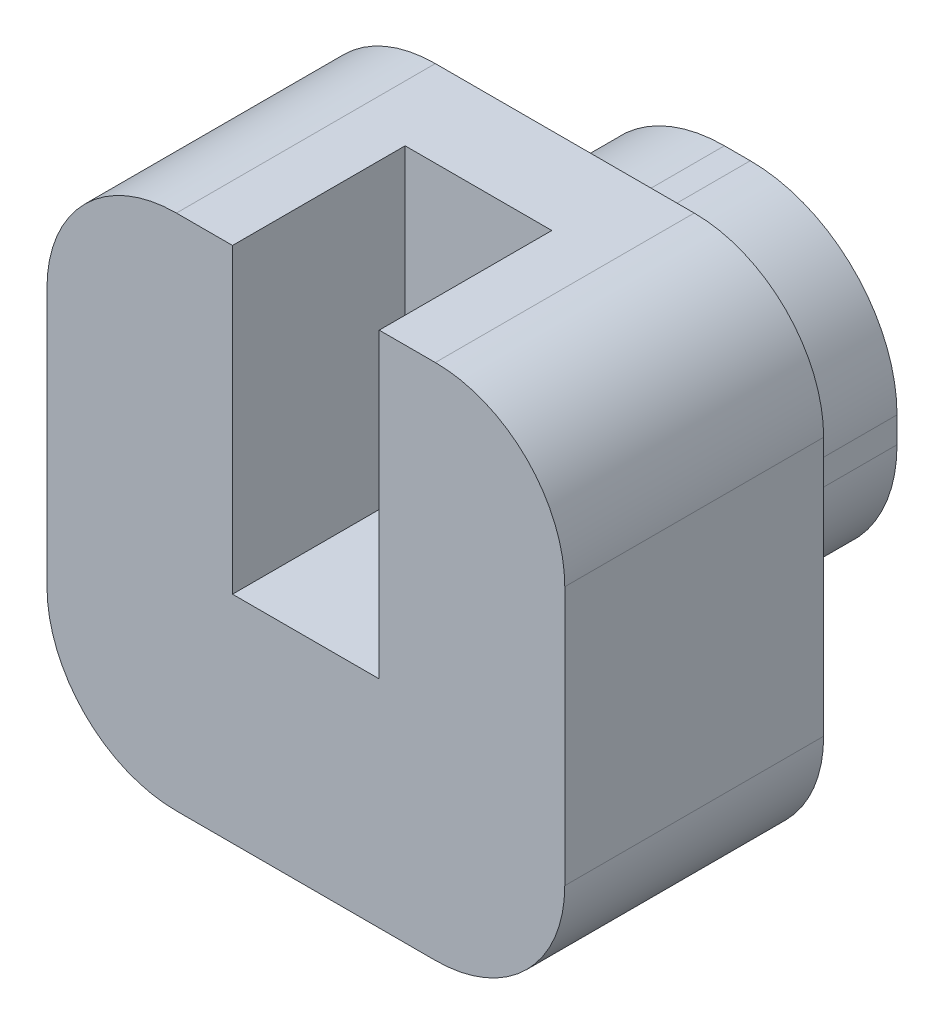
ISO-10303-21;
HEADER;
FILE_DESCRIPTION(('STEP AP214'),'2;1');
FILE_NAME('part.step','',(''),(''),'','','');
FILE_SCHEMA(('AUTOMOTIVE_DESIGN { 1 0 10303 214 1 1 1 1 }'));
ENDSEC;
DATA;
#1=APPLICATION_CONTEXT('core data for automotive mechanical design processes');
#2=APPLICATION_PROTOCOL_DEFINITION('international standard','automotive_design',2000,#1);
#3=PRODUCT_CONTEXT('',#1,'mechanical');
#4=PRODUCT('Part','Part','',(#3));
#5=PRODUCT_RELATED_PRODUCT_CATEGORY('part','',(#4));
#6=PRODUCT_DEFINITION_FORMATION('','',#4);
#7=PRODUCT_DEFINITION_CONTEXT('part definition',#1,'design');
#8=PRODUCT_DEFINITION('design','',#6,#7);
#9=PRODUCT_DEFINITION_SHAPE('','',#8);
#10=(LENGTH_UNIT() NAMED_UNIT(*) SI_UNIT(.MILLI.,.METRE.));
#11=(NAMED_UNIT(*) PLANE_ANGLE_UNIT() SI_UNIT($,.RADIAN.));
#12=(NAMED_UNIT(*) SI_UNIT($,.STERADIAN.) SOLID_ANGLE_UNIT());
#13=UNCERTAINTY_MEASURE_WITH_UNIT(LENGTH_MEASURE(1.E-05),#10,'distance_accuracy_value','');
#14=(GEOMETRIC_REPRESENTATION_CONTEXT(3) GLOBAL_UNCERTAINTY_ASSIGNED_CONTEXT((#13)) GLOBAL_UNIT_ASSIGNED_CONTEXT((#10,
#11,#12)) REPRESENTATION_CONTEXT('',''));
#15=CARTESIAN_POINT('',(0.,0.,0.));
#16=DIRECTION('',(0.,0.,1.));
#17=DIRECTION('',(1.,0.,0.));
#18=AXIS2_PLACEMENT_3D('',#15,#16,#17);
#19=CARTESIAN_POINT('',(-0.15,-0.15,2.));
#20=DIRECTION('',(0.,0.,-1.));
#21=DIRECTION('',(-1.,0.,0.));
#22=AXIS2_PLACEMENT_3D('',#19,#20,#21);
#23=CYLINDRICAL_SURFACE('',#22,1.7);
#24=CARTESIAN_POINT('',(-0.15,-0.15,0.));
#25=DIRECTION('',(0.,0.,1.));
#26=DIRECTION('',(1.,0.,0.));
#27=AXIS2_PLACEMENT_3D('',#24,#25,#26);
#28=CIRCLE('',#27,1.7);
#29=CARTESIAN_POINT('',(-1.85,-0.15,0.));
#30=VERTEX_POINT('',#29);
#31=CARTESIAN_POINT('',(-0.15,-1.85,0.));
#32=VERTEX_POINT('',#31);
#33=EDGE_CURVE('E161',#30,#32,#28,.T.);
#34=ORIENTED_EDGE('',*,*,#33,.T.);
#35=DIRECTION('',(0.,0.,-1.));
#36=VECTOR('',#35,1.);
#37=CARTESIAN_POINT('',(-0.15,-1.85,2.));
#38=LINE('',#37,#36);
#39=CARTESIAN_POINT('',(-0.15,-1.85,2.));
#40=VERTEX_POINT('',#39);
#41=EDGE_CURVE('E11',#40,#32,#38,.T.);
#42=ORIENTED_EDGE('',*,*,#41,.F.);
#43=CARTESIAN_POINT('',(-0.15,-0.15,2.));
#44=DIRECTION('',(0.,0.,1.));
#45=DIRECTION('',(1.,0.,0.));
#46=AXIS2_PLACEMENT_3D('',#43,#44,#45);
#47=CIRCLE('',#46,1.7);
#48=CARTESIAN_POINT('',(-1.85,-0.15,2.));
#49=VERTEX_POINT('',#48);
#50=EDGE_CURVE('E185',#49,#40,#47,.T.);
#51=ORIENTED_EDGE('',*,*,#50,.F.);
#52=DIRECTION('',(0.,0.,-1.));
#53=VECTOR('',#52,1.);
#54=CARTESIAN_POINT('',(-1.85,-0.15,2.));
#55=LINE('',#54,#53);
#56=EDGE_CURVE('E160',#49,#30,#55,.T.);
#57=ORIENTED_EDGE('',*,*,#56,.T.);
#58=EDGE_LOOP('',(#34,#42,#51,#57));
#59=FACE_BOUND('',#58,.T.);
#60=ADVANCED_FACE('F39',(#59),#23,.T.);
#61=CARTESIAN_POINT('',(-0.15,-1.85,2.));
#62=DIRECTION('',(0.,1.,0.));
#63=DIRECTION('',(0.,0.,1.));
#64=AXIS2_PLACEMENT_3D('',#61,#62,#63);
#65=PLANE('',#64);
#66=DIRECTION('',(1.,0.,0.));
#67=VECTOR('',#66,1.);
#68=CARTESIAN_POINT('',(-0.15,-1.85,0.));
#69=LINE('',#68,#67);
#70=CARTESIAN_POINT('',(0.150000000000001,-1.85,0.));
#71=VERTEX_POINT('',#70);
#72=EDGE_CURVE('E165',#32,#71,#69,.T.);
#73=ORIENTED_EDGE('',*,*,#72,.T.);
#74=DIRECTION('',(0.,0.,-1.));
#75=VECTOR('',#74,1.);
#76=CARTESIAN_POINT('',(0.150000000000001,-1.85,2.));
#77=LINE('',#76,#75);
#78=CARTESIAN_POINT('',(0.150000000000001,-1.85,2.));
#79=VERTEX_POINT('',#78);
#80=EDGE_CURVE('E47',#79,#71,#77,.T.);
#81=ORIENTED_EDGE('',*,*,#80,.F.);
#82=DIRECTION('',(1.,0.,0.));
#83=VECTOR('',#82,1.);
#84=CARTESIAN_POINT('',(-0.15,-1.85,2.));
#85=LINE('',#84,#83);
#86=EDGE_CURVE('E104',#40,#79,#85,.T.);
#87=ORIENTED_EDGE('',*,*,#86,.F.);
#88=ORIENTED_EDGE('',*,*,#41,.T.);
#89=EDGE_LOOP('',(#73,#81,#87,#88));
#90=FACE_BOUND('',#89,.T.);
#91=ADVANCED_FACE('F467',(#90),#65,.F.);
#92=CARTESIAN_POINT('',(0.15,-0.15,2.));
#93=DIRECTION('',(0.,0.,-1.));
#94=DIRECTION('',(-1.,0.,0.));
#95=AXIS2_PLACEMENT_3D('',#92,#93,#94);
#96=CYLINDRICAL_SURFACE('',#95,1.7);
#97=CARTESIAN_POINT('',(0.15,-0.15,0.));
#98=DIRECTION('',(0.,0.,1.));
#99=DIRECTION('',(-1.,0.,0.));
#100=AXIS2_PLACEMENT_3D('',#97,#98,#99);
#101=CIRCLE('',#100,1.7);
#102=CARTESIAN_POINT('',(1.85,-0.15,0.));
#103=VERTEX_POINT('',#102);
#104=EDGE_CURVE('E169',#71,#103,#101,.T.);
#105=ORIENTED_EDGE('',*,*,#104,.T.);
#106=DIRECTION('',(0.,0.,-1.));
#107=VECTOR('',#106,1.);
#108=CARTESIAN_POINT('',(1.85,-0.15,2.));
#109=LINE('',#108,#107);
#110=CARTESIAN_POINT('',(1.85,-0.15,2.));
#111=VERTEX_POINT('',#110);
#112=EDGE_CURVE('E194',#111,#103,#109,.T.);
#113=ORIENTED_EDGE('',*,*,#112,.F.);
#114=CARTESIAN_POINT('',(0.15,-0.15,2.));
#115=DIRECTION('',(0.,0.,1.));
#116=DIRECTION('',(-1.,0.,0.));
#117=AXIS2_PLACEMENT_3D('',#114,#115,#116);
#118=CIRCLE('',#117,1.7);
#119=EDGE_CURVE('E151',#79,#111,#118,.T.);
#120=ORIENTED_EDGE('',*,*,#119,.F.);
#121=ORIENTED_EDGE('',*,*,#80,.T.);
#122=EDGE_LOOP('',(#105,#113,#120,#121));
#123=FACE_BOUND('',#122,.T.);
#124=ADVANCED_FACE('F202',(#123),#96,.T.);
#125=CARTESIAN_POINT('',(1.85,-0.15,2.));
#126=DIRECTION('',(-1.,0.,0.));
#127=DIRECTION('',(0.,0.,1.));
#128=AXIS2_PLACEMENT_3D('',#125,#126,#127);
#129=PLANE('',#128);
#130=DIRECTION('',(0.,1.,0.));
#131=VECTOR('',#130,1.);
#132=CARTESIAN_POINT('',(1.85,-0.15,0.));
#133=LINE('',#132,#131);
#134=CARTESIAN_POINT('',(1.85,0.150000000000001,0.));
#135=VERTEX_POINT('',#134);
#136=EDGE_CURVE('E172',#103,#135,#133,.T.);
#137=ORIENTED_EDGE('',*,*,#136,.T.);
#138=DIRECTION('',(0.,0.,-1.));
#139=VECTOR('',#138,1.);
#140=CARTESIAN_POINT('',(1.85,0.150000000000001,2.));
#141=LINE('',#140,#139);
#142=CARTESIAN_POINT('',(1.85,0.150000000000001,2.));
#143=VERTEX_POINT('',#142);
#144=EDGE_CURVE('E131',#143,#135,#141,.T.);
#145=ORIENTED_EDGE('',*,*,#144,.F.);
#146=DIRECTION('',(0.,1.,0.));
#147=VECTOR('',#146,1.);
#148=CARTESIAN_POINT('',(1.85,-0.15,2.));
#149=LINE('',#148,#147);
#150=EDGE_CURVE('E147',#111,#143,#149,.T.);
#151=ORIENTED_EDGE('',*,*,#150,.F.);
#152=ORIENTED_EDGE('',*,*,#112,.T.);
#153=EDGE_LOOP('',(#137,#145,#151,#152));
#154=FACE_BOUND('',#153,.T.);
#155=ADVANCED_FACE('F208',(#154),#129,.F.);
#156=CARTESIAN_POINT('',(0.15,0.150000000000001,2.));
#157=DIRECTION('',(0.,0.,-1.));
#158=DIRECTION('',(-1.,0.,0.));
#159=AXIS2_PLACEMENT_3D('',#156,#157,#158);
#160=CYLINDRICAL_SURFACE('',#159,1.7);
#161=CARTESIAN_POINT('',(0.15,0.150000000000001,0.));
#162=DIRECTION('',(0.,0.,1.));
#163=DIRECTION('',(1.,0.,0.));
#164=AXIS2_PLACEMENT_3D('',#161,#162,#163);
#165=CIRCLE('',#164,1.7);
#166=CARTESIAN_POINT('',(0.15,1.85,0.));
#167=VERTEX_POINT('',#166);
#168=EDGE_CURVE('E127',#135,#167,#165,.T.);
#169=ORIENTED_EDGE('',*,*,#168,.T.);
#170=DIRECTION('',(0.,0.,-1.));
#171=VECTOR('',#170,1.);
#172=CARTESIAN_POINT('',(0.15,1.85,2.));
#173=LINE('',#172,#171);
#174=CARTESIAN_POINT('',(0.15,1.85,2.));
#175=VERTEX_POINT('',#174);
#176=EDGE_CURVE('E119',#175,#167,#173,.T.);
#177=ORIENTED_EDGE('',*,*,#176,.F.);
#178=CARTESIAN_POINT('',(0.15,0.150000000000001,2.));
#179=DIRECTION('',(0.,0.,1.));
#180=DIRECTION('',(1.,0.,0.));
#181=AXIS2_PLACEMENT_3D('',#178,#179,#180);
#182=CIRCLE('',#181,1.7);
#183=EDGE_CURVE('E124',#143,#175,#182,.T.);
#184=ORIENTED_EDGE('',*,*,#183,.F.);
#185=ORIENTED_EDGE('',*,*,#144,.T.);
#186=EDGE_LOOP('',(#169,#177,#184,#185));
#187=FACE_BOUND('',#186,.T.);
#188=ADVANCED_FACE('F121',(#187),#160,.T.);
#189=CARTESIAN_POINT('',(-0.15,1.85,2.));
#190=DIRECTION('',(0.,-1.,0.));
#191=DIRECTION('',(0.,0.,-1.));
#192=AXIS2_PLACEMENT_3D('',#189,#190,#191);
#193=PLANE('',#192);
#194=DIRECTION('',(-1.,0.,0.));
#195=VECTOR('',#194,1.);
#196=CARTESIAN_POINT('',(-0.15,1.85,0.));
#197=LINE('',#196,#195);
#198=CARTESIAN_POINT('',(-0.15,1.85,0.));
#199=VERTEX_POINT('',#198);
#200=EDGE_CURVE('E177',#167,#199,#197,.T.);
#201=ORIENTED_EDGE('',*,*,#200,.T.);
#202=DIRECTION('',(0.,0.,-1.));
#203=VECTOR('',#202,1.);
#204=CARTESIAN_POINT('',(-0.15,1.85,2.));
#205=LINE('',#204,#203);
#206=CARTESIAN_POINT('',(-0.15,1.85,2.));
#207=VERTEX_POINT('',#206);
#208=EDGE_CURVE('E132',#207,#199,#205,.T.);
#209=ORIENTED_EDGE('',*,*,#208,.F.);
#210=DIRECTION('',(-1.,0.,0.));
#211=VECTOR('',#210,1.);
#212=CARTESIAN_POINT('',(-0.15,1.85,2.));
#213=LINE('',#212,#211);
#214=EDGE_CURVE('E135',#175,#207,#213,.T.);
#215=ORIENTED_EDGE('',*,*,#214,.F.);
#216=ORIENTED_EDGE('',*,*,#176,.T.);
#217=EDGE_LOOP('',(#201,#209,#215,#216));
#218=FACE_BOUND('',#217,.T.);
#219=ADVANCED_FACE('F136',(#218),#193,.F.);
#220=CARTESIAN_POINT('',(-0.15,0.150000000000001,2.));
#221=DIRECTION('',(0.,0.,-1.));
#222=DIRECTION('',(-1.,0.,0.));
#223=AXIS2_PLACEMENT_3D('',#220,#221,#222);
#224=CYLINDRICAL_SURFACE('',#223,1.7);
#225=CARTESIAN_POINT('',(-0.15,0.150000000000001,0.));
#226=DIRECTION('',(0.,0.,1.));
#227=DIRECTION('',(1.,0.,0.));
#228=AXIS2_PLACEMENT_3D('',#225,#226,#227);
#229=CIRCLE('',#228,1.7);
#230=CARTESIAN_POINT('',(-1.85,0.150000000000001,0.));
#231=VERTEX_POINT('',#230);
#232=EDGE_CURVE('E180',#199,#231,#229,.T.);
#233=ORIENTED_EDGE('',*,*,#232,.T.);
#234=DIRECTION('',(0.,0.,-1.));
#235=VECTOR('',#234,1.);
#236=CARTESIAN_POINT('',(-1.85,0.150000000000001,2.));
#237=LINE('',#236,#235);
#238=CARTESIAN_POINT('',(-1.85,0.150000000000001,2.));
#239=VERTEX_POINT('',#238);
#240=EDGE_CURVE('E63',#239,#231,#237,.T.);
#241=ORIENTED_EDGE('',*,*,#240,.F.);
#242=CARTESIAN_POINT('',(-0.15,0.150000000000001,2.));
#243=DIRECTION('',(0.,0.,1.));
#244=DIRECTION('',(1.,0.,0.));
#245=AXIS2_PLACEMENT_3D('',#242,#243,#244);
#246=CIRCLE('',#245,1.7);
#247=EDGE_CURVE('E141',#207,#239,#246,.T.);
#248=ORIENTED_EDGE('',*,*,#247,.F.);
#249=ORIENTED_EDGE('',*,*,#208,.T.);
#250=EDGE_LOOP('',(#233,#241,#248,#249));
#251=FACE_BOUND('',#250,.T.);
#252=ADVANCED_FACE('F474',(#251),#224,.T.);
#253=CARTESIAN_POINT('',(-1.85,-0.15,2.));
#254=DIRECTION('',(1.,0.,0.));
#255=DIRECTION('',(0.,0.,-1.));
#256=AXIS2_PLACEMENT_3D('',#253,#254,#255);
#257=PLANE('',#256);
#258=DIRECTION('',(0.,-1.,0.));
#259=VECTOR('',#258,1.);
#260=CARTESIAN_POINT('',(-1.85,-0.15,0.));
#261=LINE('',#260,#259);
#262=EDGE_CURVE('E96',#231,#30,#261,.T.);
#263=ORIENTED_EDGE('',*,*,#262,.T.);
#264=ORIENTED_EDGE('',*,*,#56,.F.);
#265=DIRECTION('',(0.,-1.,0.));
#266=VECTOR('',#265,1.);
#267=CARTESIAN_POINT('',(-1.85,-0.15,2.));
#268=LINE('',#267,#266);
#269=EDGE_CURVE('E157',#239,#49,#268,.T.);
#270=ORIENTED_EDGE('',*,*,#269,.F.);
#271=ORIENTED_EDGE('',*,*,#240,.T.);
#272=EDGE_LOOP('',(#263,#264,#270,#271));
#273=FACE_BOUND('',#272,.T.);
#274=ADVANCED_FACE('F475',(#273),#257,.F.);
#275=CARTESIAN_POINT('',(-0.15,-0.15,0.));
#276=DIRECTION('',(0.,0.,1.));
#277=DIRECTION('',(1.,0.,0.));
#278=AXIS2_PLACEMENT_3D('',#275,#276,#277);
#279=PLANE('',#278);
#280=ORIENTED_EDGE('',*,*,#33,.F.);
#281=ORIENTED_EDGE('',*,*,#262,.F.);
#282=ORIENTED_EDGE('',*,*,#232,.F.);
#283=ORIENTED_EDGE('',*,*,#200,.F.);
#284=ORIENTED_EDGE('',*,*,#168,.F.);
#285=ORIENTED_EDGE('',*,*,#136,.F.);
#286=ORIENTED_EDGE('',*,*,#104,.F.);
#287=ORIENTED_EDGE('',*,*,#72,.F.);
#288=EDGE_LOOP('',(#280,#281,#282,#283,#284,#285,#286,#287));
#289=FACE_BOUND('',#288,.T.);
#290=ADVANCED_FACE('F206',(#289),#279,.F.);
#291=CARTESIAN_POINT('',(1.5,1.5,2.));
#292=DIRECTION('',(0.,0.,1.));
#293=DIRECTION('',(1.,0.,0.));
#294=AXIS2_PLACEMENT_3D('',#291,#292,#293);
#295=PLANE('',#294);
#296=DIRECTION('',(1.,0.,0.));
#297=VECTOR('',#296,1.);
#298=CARTESIAN_POINT('',(-1.5,3.,2.));
#299=LINE('',#298,#297);
#300=CARTESIAN_POINT('',(-1.5,3.,2.));
#301=VERTEX_POINT('',#300);
#302=CARTESIAN_POINT('',(1.5,3.,2.));
#303=VERTEX_POINT('',#302);
#304=EDGE_CURVE('E277',#301,#303,#299,.T.);
#305=ORIENTED_EDGE('',*,*,#304,.T.);
#306=CARTESIAN_POINT('',(1.5,1.5,2.));
#307=DIRECTION('',(0.,0.,1.));
#308=DIRECTION('',(1.,0.,0.));
#309=AXIS2_PLACEMENT_3D('',#306,#307,#308);
#310=CIRCLE('',#309,1.5);
#311=CARTESIAN_POINT('',(3.,1.5,2.));
#312=VERTEX_POINT('',#311);
#313=EDGE_CURVE('E273',#312,#303,#310,.T.);
#314=ORIENTED_EDGE('',*,*,#313,.F.);
#315=DIRECTION('',(0.,1.,0.));
#316=VECTOR('',#315,1.);
#317=CARTESIAN_POINT('',(3.,-1.5,2.));
#318=LINE('',#317,#316);
#319=CARTESIAN_POINT('',(3.,-1.5,2.));
#320=VERTEX_POINT('',#319);
#321=EDGE_CURVE('E269',#320,#312,#318,.T.);
#322=ORIENTED_EDGE('',*,*,#321,.F.);
#323=CARTESIAN_POINT('',(1.5,-1.5,2.));
#324=DIRECTION('',(0.,0.,1.));
#325=DIRECTION('',(1.,0.,0.));
#326=AXIS2_PLACEMENT_3D('',#323,#324,#325);
#327=CIRCLE('',#326,1.5);
#328=CARTESIAN_POINT('',(1.5,-3.,2.));
#329=VERTEX_POINT('',#328);
#330=EDGE_CURVE('E265',#329,#320,#327,.T.);
#331=ORIENTED_EDGE('',*,*,#330,.F.);
#332=DIRECTION('',(1.,0.,0.));
#333=VECTOR('',#332,1.);
#334=CARTESIAN_POINT('',(-1.5,-3.,2.));
#335=LINE('',#334,#333);
#336=CARTESIAN_POINT('',(-1.5,-3.,2.));
#337=VERTEX_POINT('',#336);
#338=EDGE_CURVE('E261',#337,#329,#335,.T.);
#339=ORIENTED_EDGE('',*,*,#338,.F.);
#340=CARTESIAN_POINT('',(-1.5,-1.5,2.));
#341=DIRECTION('',(0.,0.,-1.));
#342=DIRECTION('',(-1.,0.,0.));
#343=AXIS2_PLACEMENT_3D('',#340,#341,#342);
#344=CIRCLE('',#343,1.5);
#345=CARTESIAN_POINT('',(-3.,-1.5,2.));
#346=VERTEX_POINT('',#345);
#347=EDGE_CURVE('E257',#337,#346,#344,.T.);
#348=ORIENTED_EDGE('',*,*,#347,.T.);
#349=DIRECTION('',(0.,1.,0.));
#350=VECTOR('',#349,1.);
#351=CARTESIAN_POINT('',(-3.,-1.5,2.));
#352=LINE('',#351,#350);
#353=CARTESIAN_POINT('',(-3.,1.5,2.));
#354=VERTEX_POINT('',#353);
#355=EDGE_CURVE('E253',#346,#354,#352,.T.);
#356=ORIENTED_EDGE('',*,*,#355,.T.);
#357=CARTESIAN_POINT('',(-1.5,1.5,2.));
#358=DIRECTION('',(0.,0.,-1.));
#359=DIRECTION('',(-1.,0.,0.));
#360=AXIS2_PLACEMENT_3D('',#357,#358,#359);
#361=CIRCLE('',#360,1.5);
#362=EDGE_CURVE('E248',#354,#301,#361,.T.);
#363=ORIENTED_EDGE('',*,*,#362,.T.);
#364=EDGE_LOOP('',(#305,#314,#322,#331,#339,#348,#356,#363));
#365=FACE_BOUND('',#364,.T.);
#366=ORIENTED_EDGE('',*,*,#269,.T.);
#367=ORIENTED_EDGE('',*,*,#50,.T.);
#368=ORIENTED_EDGE('',*,*,#86,.T.);
#369=ORIENTED_EDGE('',*,*,#119,.T.);
#370=ORIENTED_EDGE('',*,*,#150,.T.);
#371=ORIENTED_EDGE('',*,*,#183,.T.);
#372=ORIENTED_EDGE('',*,*,#214,.T.);
#373=ORIENTED_EDGE('',*,*,#247,.T.);
#374=EDGE_LOOP('',(#366,#367,#368,#369,#370,#371,#372,#373));
#375=FACE_BOUND('',#374,.T.);
#376=ADVANCED_FACE('F144',(#365,#375),#295,.F.);
#377=CARTESIAN_POINT('',(-1.5,3.,5.));
#378=DIRECTION('',(0.,1.,0.));
#379=DIRECTION('',(0.,0.,1.));
#380=AXIS2_PLACEMENT_3D('',#377,#378,#379);
#381=PLANE('',#380);
#382=DIRECTION('',(0.,0.,-1.));
#383=VECTOR('',#382,1.);
#384=CARTESIAN_POINT('',(0.850000000000001,3.,5.));
#385=LINE('',#384,#383);
#386=CARTESIAN_POINT('',(0.850000000000001,3.,5.));
#387=VERTEX_POINT('',#386);
#388=CARTESIAN_POINT('',(0.850000000000001,3.,3.));
#389=VERTEX_POINT('',#388);
#390=EDGE_CURVE('E338',#387,#389,#385,.T.);
#391=ORIENTED_EDGE('',*,*,#390,.F.);
#392=DIRECTION('',(1.,0.,0.));
#393=VECTOR('',#392,1.);
#394=CARTESIAN_POINT('',(-1.5,3.,5.));
#395=LINE('',#394,#393);
#396=CARTESIAN_POINT('',(1.5,3.,5.));
#397=VERTEX_POINT('',#396);
#398=EDGE_CURVE('E252',#387,#397,#395,.T.);
#399=ORIENTED_EDGE('',*,*,#398,.T.);
#400=DIRECTION('',(0.,0.,-1.));
#401=VECTOR('',#400,1.);
#402=CARTESIAN_POINT('',(1.5,3.,5.));
#403=LINE('',#402,#401);
#404=EDGE_CURVE('E216',#397,#303,#403,.T.);
#405=ORIENTED_EDGE('',*,*,#404,.T.);
#406=ORIENTED_EDGE('',*,*,#304,.F.);
#407=DIRECTION('',(0.,0.,-1.));
#408=VECTOR('',#407,1.);
#409=CARTESIAN_POINT('',(-1.5,3.,5.));
#410=LINE('',#409,#408);
#411=CARTESIAN_POINT('',(-1.5,3.,5.));
#412=VERTEX_POINT('',#411);
#413=EDGE_CURVE('E166',#412,#301,#410,.T.);
#414=ORIENTED_EDGE('',*,*,#413,.F.);
#415=CARTESIAN_POINT('',(-0.849999999999999,3.,5.));
#416=VERTEX_POINT('',#415);
#417=EDGE_CURVE('E309',#412,#416,#395,.T.);
#418=ORIENTED_EDGE('',*,*,#417,.T.);
#419=DIRECTION('',(0.,0.,1.));
#420=VECTOR('',#419,1.);
#421=CARTESIAN_POINT('',(-0.849999999999999,3.,5.));
#422=LINE('',#421,#420);
#423=CARTESIAN_POINT('',(-0.849999999999999,3.,3.));
#424=VERTEX_POINT('',#423);
#425=EDGE_CURVE('E329',#424,#416,#422,.T.);
#426=ORIENTED_EDGE('',*,*,#425,.F.);
#427=DIRECTION('',(-1.,0.,0.));
#428=VECTOR('',#427,1.);
#429=CARTESIAN_POINT('',(-0.849999999999999,3.,3.));
#430=LINE('',#429,#428);
#431=EDGE_CURVE('E334',#389,#424,#430,.T.);
#432=ORIENTED_EDGE('',*,*,#431,.F.);
#433=EDGE_LOOP('',(#391,#399,#405,#406,#414,#418,#426,#432));
#434=FACE_BOUND('',#433,.T.);
#435=ADVANCED_FACE('F418',(#434),#381,.T.);
#436=CARTESIAN_POINT('',(-1.5,1.5,5.));
#437=DIRECTION('',(0.,0.,-1.));
#438=DIRECTION('',(-1.,0.,0.));
#439=AXIS2_PLACEMENT_3D('',#436,#437,#438);
#440=CYLINDRICAL_SURFACE('',#439,1.5);
#441=ORIENTED_EDGE('',*,*,#362,.F.);
#442=DIRECTION('',(0.,0.,-1.));
#443=VECTOR('',#442,1.);
#444=CARTESIAN_POINT('',(-3.,1.5,5.));
#445=LINE('',#444,#443);
#446=CARTESIAN_POINT('',(-3.,1.5,5.));
#447=VERTEX_POINT('',#446);
#448=EDGE_CURVE('E241',#447,#354,#445,.T.);
#449=ORIENTED_EDGE('',*,*,#448,.F.);
#450=CARTESIAN_POINT('',(-1.5,1.5,5.));
#451=DIRECTION('',(0.,0.,-1.));
#452=DIRECTION('',(-1.,0.,0.));
#453=AXIS2_PLACEMENT_3D('',#450,#451,#452);
#454=CIRCLE('',#453,1.5);
#455=EDGE_CURVE('E221',#447,#412,#454,.T.);
#456=ORIENTED_EDGE('',*,*,#455,.T.);
#457=ORIENTED_EDGE('',*,*,#413,.T.);
#458=EDGE_LOOP('',(#441,#449,#456,#457));
#459=FACE_BOUND('',#458,.T.);
#460=ADVANCED_FACE('F414',(#459),#440,.T.);
#461=CARTESIAN_POINT('',(-3.,-1.5,5.));
#462=DIRECTION('',(-1.,0.,0.));
#463=DIRECTION('',(0.,0.,1.));
#464=AXIS2_PLACEMENT_3D('',#461,#462,#463);
#465=PLANE('',#464);
#466=ORIENTED_EDGE('',*,*,#355,.F.);
#467=DIRECTION('',(0.,0.,-1.));
#468=VECTOR('',#467,1.);
#469=CARTESIAN_POINT('',(-3.,-1.5,5.));
#470=LINE('',#469,#468);
#471=CARTESIAN_POINT('',(-3.,-1.5,5.));
#472=VERTEX_POINT('',#471);
#473=EDGE_CURVE('E237',#472,#346,#470,.T.);
#474=ORIENTED_EDGE('',*,*,#473,.F.);
#475=DIRECTION('',(0.,1.,0.));
#476=VECTOR('',#475,1.);
#477=CARTESIAN_POINT('',(-3.,-1.5,5.));
#478=LINE('',#477,#476);
#479=EDGE_CURVE('E285',#472,#447,#478,.T.);
#480=ORIENTED_EDGE('',*,*,#479,.T.);
#481=ORIENTED_EDGE('',*,*,#448,.T.);
#482=EDGE_LOOP('',(#466,#474,#480,#481));
#483=FACE_BOUND('',#482,.T.);
#484=ADVANCED_FACE('F426',(#483),#465,.T.);
#485=CARTESIAN_POINT('',(-1.5,-1.5,5.));
#486=DIRECTION('',(0.,0.,-1.));
#487=DIRECTION('',(-1.,0.,0.));
#488=AXIS2_PLACEMENT_3D('',#485,#486,#487);
#489=CYLINDRICAL_SURFACE('',#488,1.5);
#490=ORIENTED_EDGE('',*,*,#347,.F.);
#491=DIRECTION('',(0.,0.,-1.));
#492=VECTOR('',#491,1.);
#493=CARTESIAN_POINT('',(-1.5,-3.,5.));
#494=LINE('',#493,#492);
#495=CARTESIAN_POINT('',(-1.5,-3.,5.));
#496=VERTEX_POINT('',#495);
#497=EDGE_CURVE('E233',#496,#337,#494,.T.);
#498=ORIENTED_EDGE('',*,*,#497,.F.);
#499=CARTESIAN_POINT('',(-1.5,-1.5,5.));
#500=DIRECTION('',(0.,0.,-1.));
#501=DIRECTION('',(-1.,0.,0.));
#502=AXIS2_PLACEMENT_3D('',#499,#500,#501);
#503=CIRCLE('',#502,1.5);
#504=EDGE_CURVE('E289',#496,#472,#503,.T.);
#505=ORIENTED_EDGE('',*,*,#504,.T.);
#506=ORIENTED_EDGE('',*,*,#473,.T.);
#507=EDGE_LOOP('',(#490,#498,#505,#506));
#508=FACE_BOUND('',#507,.T.);
#509=ADVANCED_FACE('F457',(#508),#489,.T.);
#510=CARTESIAN_POINT('',(-1.5,-3.,5.));
#511=DIRECTION('',(0.,1.,0.));
#512=DIRECTION('',(0.,0.,1.));
#513=AXIS2_PLACEMENT_3D('',#510,#511,#512);
#514=PLANE('',#513);
#515=ORIENTED_EDGE('',*,*,#338,.T.);
#516=DIRECTION('',(0.,0.,-1.));
#517=VECTOR('',#516,1.);
#518=CARTESIAN_POINT('',(1.5,-3.,5.));
#519=LINE('',#518,#517);
#520=CARTESIAN_POINT('',(1.5,-3.,5.));
#521=VERTEX_POINT('',#520);
#522=EDGE_CURVE('E229',#521,#329,#519,.T.);
#523=ORIENTED_EDGE('',*,*,#522,.F.);
#524=DIRECTION('',(1.,0.,0.));
#525=VECTOR('',#524,1.);
#526=CARTESIAN_POINT('',(-1.5,-3.,5.));
#527=LINE('',#526,#525);
#528=EDGE_CURVE('E293',#496,#521,#527,.T.);
#529=ORIENTED_EDGE('',*,*,#528,.F.);
#530=ORIENTED_EDGE('',*,*,#497,.T.);
#531=EDGE_LOOP('',(#515,#523,#529,#530));
#532=FACE_BOUND('',#531,.T.);
#533=ADVANCED_FACE('F455',(#532),#514,.F.);
#534=CARTESIAN_POINT('',(1.5,-1.5,5.));
#535=DIRECTION('',(0.,0.,-1.));
#536=DIRECTION('',(-1.,0.,0.));
#537=AXIS2_PLACEMENT_3D('',#534,#535,#536);
#538=CYLINDRICAL_SURFACE('',#537,1.5);
#539=ORIENTED_EDGE('',*,*,#330,.T.);
#540=DIRECTION('',(0.,0.,-1.));
#541=VECTOR('',#540,1.);
#542=CARTESIAN_POINT('',(3.,-1.5,5.));
#543=LINE('',#542,#541);
#544=CARTESIAN_POINT('',(3.,-1.5,5.));
#545=VERTEX_POINT('',#544);
#546=EDGE_CURVE('E225',#545,#320,#543,.T.);
#547=ORIENTED_EDGE('',*,*,#546,.F.);
#548=CARTESIAN_POINT('',(1.5,-1.5,5.));
#549=DIRECTION('',(0.,0.,1.));
#550=DIRECTION('',(1.,0.,0.));
#551=AXIS2_PLACEMENT_3D('',#548,#549,#550);
#552=CIRCLE('',#551,1.5);
#553=EDGE_CURVE('E297',#521,#545,#552,.T.);
#554=ORIENTED_EDGE('',*,*,#553,.F.);
#555=ORIENTED_EDGE('',*,*,#522,.T.);
#556=EDGE_LOOP('',(#539,#547,#554,#555));
#557=FACE_BOUND('',#556,.T.);
#558=ADVANCED_FACE('F451',(#557),#538,.T.);
#559=CARTESIAN_POINT('',(3.,-1.5,5.));
#560=DIRECTION('',(-1.,0.,0.));
#561=DIRECTION('',(0.,-1.,0.));
#562=AXIS2_PLACEMENT_3D('',#559,#560,#561);
#563=PLANE('',#562);
#564=ORIENTED_EDGE('',*,*,#321,.T.);
#565=DIRECTION('',(0.,0.,-1.));
#566=VECTOR('',#565,1.);
#567=CARTESIAN_POINT('',(3.,1.5,5.));
#568=LINE('',#567,#566);
#569=CARTESIAN_POINT('',(3.,1.5,5.));
#570=VERTEX_POINT('',#569);
#571=EDGE_CURVE('E220',#570,#312,#568,.T.);
#572=ORIENTED_EDGE('',*,*,#571,.F.);
#573=DIRECTION('',(0.,1.,0.));
#574=VECTOR('',#573,1.);
#575=CARTESIAN_POINT('',(3.,-1.5,5.));
#576=LINE('',#575,#574);
#577=EDGE_CURVE('E301',#545,#570,#576,.T.);
#578=ORIENTED_EDGE('',*,*,#577,.F.);
#579=ORIENTED_EDGE('',*,*,#546,.T.);
#580=EDGE_LOOP('',(#564,#572,#578,#579));
#581=FACE_BOUND('',#580,.T.);
#582=ADVANCED_FACE('F447',(#581),#563,.F.);
#583=CARTESIAN_POINT('',(1.5,1.5,5.));
#584=DIRECTION('',(0.,0.,-1.));
#585=DIRECTION('',(-1.,0.,0.));
#586=AXIS2_PLACEMENT_3D('',#583,#584,#585);
#587=CYLINDRICAL_SURFACE('',#586,1.5);
#588=ORIENTED_EDGE('',*,*,#313,.T.);
#589=ORIENTED_EDGE('',*,*,#404,.F.);
#590=CARTESIAN_POINT('',(1.5,1.5,5.));
#591=DIRECTION('',(0.,0.,1.));
#592=DIRECTION('',(1.,0.,0.));
#593=AXIS2_PLACEMENT_3D('',#590,#591,#592);
#594=CIRCLE('',#593,1.5);
#595=EDGE_CURVE('E305',#570,#397,#594,.T.);
#596=ORIENTED_EDGE('',*,*,#595,.F.);
#597=ORIENTED_EDGE('',*,*,#571,.T.);
#598=EDGE_LOOP('',(#588,#589,#596,#597));
#599=FACE_BOUND('',#598,.T.);
#600=ADVANCED_FACE('F443',(#599),#587,.T.);
#601=CARTESIAN_POINT('',(1.5,1.5,5.));
#602=DIRECTION('',(0.,0.,1.));
#603=DIRECTION('',(1.,0.,0.));
#604=AXIS2_PLACEMENT_3D('',#601,#602,#603);
#605=PLANE('',#604);
#606=DIRECTION('',(0.,1.,0.));
#607=VECTOR('',#606,1.);
#608=CARTESIAN_POINT('',(0.850000000000001,-0.5,5.));
#609=LINE('',#608,#607);
#610=CARTESIAN_POINT('',(0.850000000000001,-0.5,5.));
#611=VERTEX_POINT('',#610);
#612=EDGE_CURVE('E281',#611,#387,#609,.T.);
#613=ORIENTED_EDGE('',*,*,#612,.F.);
#614=DIRECTION('',(1.,0.,0.));
#615=VECTOR('',#614,1.);
#616=CARTESIAN_POINT('',(-0.849999999999999,-0.5,5.));
#617=LINE('',#616,#615);
#618=CARTESIAN_POINT('',(-0.849999999999999,-0.5,5.));
#619=VERTEX_POINT('',#618);
#620=EDGE_CURVE('E318',#619,#611,#617,.T.);
#621=ORIENTED_EDGE('',*,*,#620,.F.);
#622=DIRECTION('',(0.,1.,0.));
#623=VECTOR('',#622,1.);
#624=CARTESIAN_POINT('',(-0.849999999999999,-0.5,5.));
#625=LINE('',#624,#623);
#626=EDGE_CURVE('E322',#619,#416,#625,.T.);
#627=ORIENTED_EDGE('',*,*,#626,.T.);
#628=ORIENTED_EDGE('',*,*,#417,.F.);
#629=ORIENTED_EDGE('',*,*,#455,.F.);
#630=ORIENTED_EDGE('',*,*,#479,.F.);
#631=ORIENTED_EDGE('',*,*,#504,.F.);
#632=ORIENTED_EDGE('',*,*,#528,.T.);
#633=ORIENTED_EDGE('',*,*,#553,.T.);
#634=ORIENTED_EDGE('',*,*,#577,.T.);
#635=ORIENTED_EDGE('',*,*,#595,.T.);
#636=ORIENTED_EDGE('',*,*,#398,.F.);
#637=EDGE_LOOP('',(#613,#621,#627,#628,#629,#630,#631,#632,#633,#634,#635,#636));
#638=FACE_BOUND('',#637,.T.);
#639=ADVANCED_FACE('F430',(#638),#605,.T.);
#640=CARTESIAN_POINT('',(0.850000000000001,-0.5,5.));
#641=DIRECTION('',(1.,0.,0.));
#642=DIRECTION('',(0.,0.,-1.));
#643=AXIS2_PLACEMENT_3D('',#640,#641,#642);
#644=PLANE('',#643);
#645=ORIENTED_EDGE('',*,*,#390,.T.);
#646=DIRECTION('',(0.,1.,0.));
#647=VECTOR('',#646,1.);
#648=CARTESIAN_POINT('',(0.850000000000001,-0.5,3.));
#649=LINE('',#648,#647);
#650=CARTESIAN_POINT('',(0.850000000000001,-0.5,3.));
#651=VERTEX_POINT('',#650);
#652=EDGE_CURVE('E313',#651,#389,#649,.T.);
#653=ORIENTED_EDGE('',*,*,#652,.F.);
#654=DIRECTION('',(0.,0.,-1.));
#655=VECTOR('',#654,1.);
#656=CARTESIAN_POINT('',(0.850000000000001,-0.5,5.));
#657=LINE('',#656,#655);
#658=EDGE_CURVE('E333',#611,#651,#657,.T.);
#659=ORIENTED_EDGE('',*,*,#658,.F.);
#660=ORIENTED_EDGE('',*,*,#612,.T.);
#661=EDGE_LOOP('',(#645,#653,#659,#660));
#662=FACE_BOUND('',#661,.T.);
#663=ADVANCED_FACE('F363',(#662),#644,.F.);
#664=CARTESIAN_POINT('',(-0.849999999999999,-0.5,5.));
#665=DIRECTION('',(-1.,0.,0.));
#666=DIRECTION('',(0.,0.,1.));
#667=AXIS2_PLACEMENT_3D('',#664,#665,#666);
#668=PLANE('',#667);
#669=ORIENTED_EDGE('',*,*,#425,.T.);
#670=ORIENTED_EDGE('',*,*,#626,.F.);
#671=DIRECTION('',(0.,0.,1.));
#672=VECTOR('',#671,1.);
#673=CARTESIAN_POINT('',(-0.849999999999999,-0.5,5.));
#674=LINE('',#673,#672);
#675=CARTESIAN_POINT('',(-0.849999999999999,-0.5,3.));
#676=VERTEX_POINT('',#675);
#677=EDGE_CURVE('E54',#676,#619,#674,.T.);
#678=ORIENTED_EDGE('',*,*,#677,.F.);
#679=DIRECTION('',(0.,1.,0.));
#680=VECTOR('',#679,1.);
#681=CARTESIAN_POINT('',(-0.849999999999999,-0.5,3.));
#682=LINE('',#681,#680);
#683=EDGE_CURVE('E317',#676,#424,#682,.T.);
#684=ORIENTED_EDGE('',*,*,#683,.T.);
#685=EDGE_LOOP('',(#669,#670,#678,#684));
#686=FACE_BOUND('',#685,.T.);
#687=ADVANCED_FACE('F434',(#686),#668,.F.);
#688=CARTESIAN_POINT('',(-0.849999999999999,-0.5,3.));
#689=DIRECTION('',(0.,0.,-1.));
#690=DIRECTION('',(-1.,0.,0.));
#691=AXIS2_PLACEMENT_3D('',#688,#689,#690);
#692=PLANE('',#691);
#693=ORIENTED_EDGE('',*,*,#431,.T.);
#694=ORIENTED_EDGE('',*,*,#683,.F.);
#695=DIRECTION('',(-1.,0.,0.));
#696=VECTOR('',#695,1.);
#697=CARTESIAN_POINT('',(-0.849999999999999,-0.5,3.));
#698=LINE('',#697,#696);
#699=EDGE_CURVE('E346',#651,#676,#698,.T.);
#700=ORIENTED_EDGE('',*,*,#699,.F.);
#701=ORIENTED_EDGE('',*,*,#652,.T.);
#702=EDGE_LOOP('',(#693,#694,#700,#701));
#703=FACE_BOUND('',#702,.T.);
#704=ADVANCED_FACE('F436',(#703),#692,.F.);
#705=CARTESIAN_POINT('',(0.,-0.5,0.));
#706=DIRECTION('',(0.,-1.,0.));
#707=DIRECTION('',(0.,0.,-1.));
#708=AXIS2_PLACEMENT_3D('',#705,#706,#707);
#709=PLANE('',#708);
#710=ORIENTED_EDGE('',*,*,#658,.T.);
#711=ORIENTED_EDGE('',*,*,#699,.T.);
#712=ORIENTED_EDGE('',*,*,#677,.T.);
#713=ORIENTED_EDGE('',*,*,#620,.T.);
#714=EDGE_LOOP('',(#710,#711,#712,#713));
#715=FACE_BOUND('',#714,.T.);
#716=ADVANCED_FACE('F353',(#715),#709,.F.);
#717=CLOSED_SHELL('',(#60,#91,#124,#155,#188,#219,#252,#274,#290,#376,#435,#460,#484,#509,#533,
#558,#582,#600,#639,#663,#687,#704,#716));
#718=MANIFOLD_SOLID_BREP('B2',#717);
#719=ADVANCED_BREP_SHAPE_REPRESENTATION('',(#18,#718),#14);
#720=SHAPE_DEFINITION_REPRESENTATION(#9,#719);
ENDSEC;
END-ISO-10303-21;
